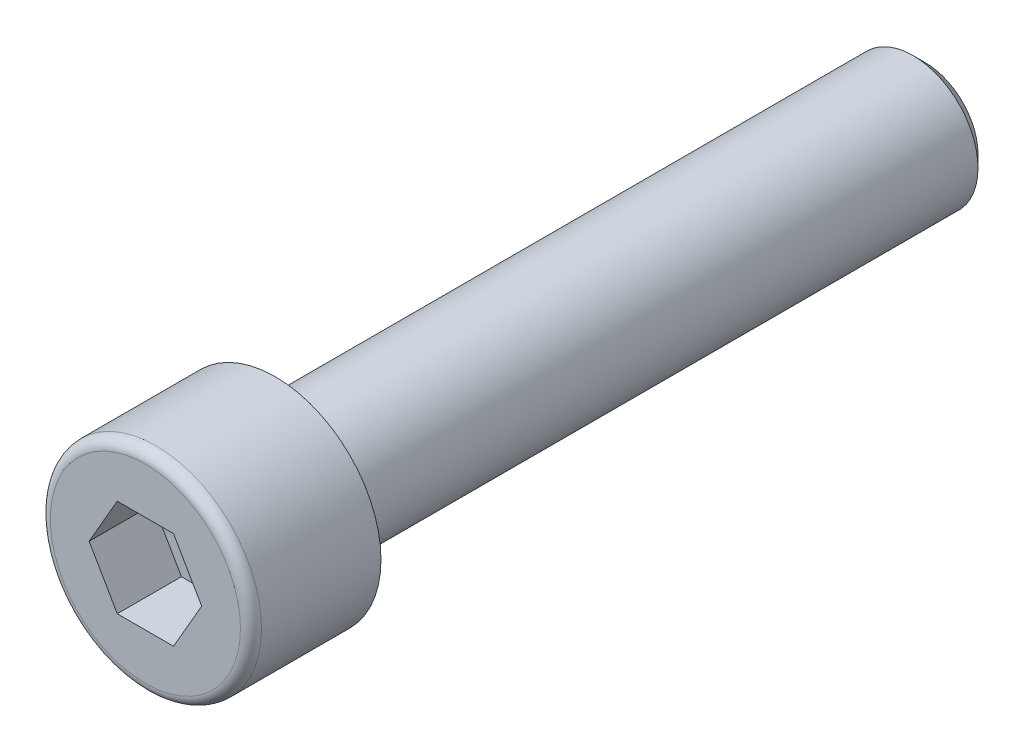
ISO-10303-21;
HEADER;
FILE_DESCRIPTION(('STEP AP214'),'2;1');
FILE_NAME('part.step','',(''),(''),'','','');
FILE_SCHEMA(('AUTOMOTIVE_DESIGN { 1 0 10303 214 1 1 1 1 }'));
ENDSEC;
DATA;
#1=APPLICATION_CONTEXT('core data for automotive mechanical design processes');
#2=APPLICATION_PROTOCOL_DEFINITION('international standard','automotive_design',2000,#1);
#3=PRODUCT_CONTEXT('',#1,'mechanical');
#4=PRODUCT('Part','Part','',(#3));
#5=PRODUCT_RELATED_PRODUCT_CATEGORY('part','',(#4));
#6=PRODUCT_DEFINITION_FORMATION('','',#4);
#7=PRODUCT_DEFINITION_CONTEXT('part definition',#1,'design');
#8=PRODUCT_DEFINITION('design','',#6,#7);
#9=PRODUCT_DEFINITION_SHAPE('','',#8);
#10=(LENGTH_UNIT() NAMED_UNIT(*) SI_UNIT(.MILLI.,.METRE.));
#11=(NAMED_UNIT(*) PLANE_ANGLE_UNIT() SI_UNIT($,.RADIAN.));
#12=(NAMED_UNIT(*) SI_UNIT($,.STERADIAN.) SOLID_ANGLE_UNIT());
#13=UNCERTAINTY_MEASURE_WITH_UNIT(LENGTH_MEASURE(1.E-05),#10,'distance_accuracy_value','');
#14=(GEOMETRIC_REPRESENTATION_CONTEXT(3) GLOBAL_UNCERTAINTY_ASSIGNED_CONTEXT((#13)) GLOBAL_UNIT_ASSIGNED_CONTEXT((#10,
#11,#12)) REPRESENTATION_CONTEXT('',''));
#15=CARTESIAN_POINT('',(0.,0.,0.));
#16=DIRECTION('',(0.,0.,1.));
#17=DIRECTION('',(1.,0.,0.));
#18=AXIS2_PLACEMENT_3D('',#15,#16,#17);
#19=CARTESIAN_POINT('',(0.,0.,4.05));
#20=DIRECTION('',(0.,0.,1.));
#21=DIRECTION('',(1.,0.,0.));
#22=AXIS2_PLACEMENT_3D('',#19,#20,#21);
#23=PLANE('',#22);
#24=DIRECTION('',(-1.,0.,0.));
#25=VECTOR('',#24,1.);
#26=CARTESIAN_POINT('',(-1.732,-2.999911998709,4.05));
#27=LINE('',#26,#25);
#28=CARTESIAN_POINT('',(1.732,-2.999911998709,4.05));
#29=VERTEX_POINT('',#28);
#30=CARTESIAN_POINT('',(-1.73199999999987,-2.99991199870892,4.05));
#31=VERTEX_POINT('',#30);
#32=EDGE_CURVE('E72',#29,#31,#27,.T.);
#33=ORIENTED_EDGE('',*,*,#32,.F.);
#34=DIRECTION('',(-0.50000000000019,-0.866025403784329,0.));
#35=VECTOR('',#34,1.);
#36=CARTESIAN_POINT('',(1.732,-2.999911998709,4.05));
#37=LINE('',#36,#35);
#38=CARTESIAN_POINT('',(3.46400000000013,0.,4.05));
#39=VERTEX_POINT('',#38);
#40=EDGE_CURVE('E133',#39,#29,#37,.T.);
#41=ORIENTED_EDGE('',*,*,#40,.F.);
#42=DIRECTION('',(0.50000000000019,-0.866025403784329,0.));
#43=VECTOR('',#42,1.);
#44=CARTESIAN_POINT('',(3.464,0.,4.05));
#45=LINE('',#44,#43);
#46=CARTESIAN_POINT('',(1.73199999999987,2.99991199870892,4.05));
#47=VERTEX_POINT('',#46);
#48=EDGE_CURVE('E143',#47,#39,#45,.T.);
#49=ORIENTED_EDGE('',*,*,#48,.F.);
#50=DIRECTION('',(1.,0.,0.));
#51=VECTOR('',#50,1.);
#52=CARTESIAN_POINT('',(1.732,2.999911998709,4.05));
#53=LINE('',#52,#51);
#54=CARTESIAN_POINT('',(-1.732,2.999911998709,4.05));
#55=VERTEX_POINT('',#54);
#56=EDGE_CURVE('E148',#55,#47,#53,.T.);
#57=ORIENTED_EDGE('',*,*,#56,.F.);
#58=DIRECTION('',(0.50000000000019,0.866025403784329,0.));
#59=VECTOR('',#58,1.);
#60=CARTESIAN_POINT('',(-1.732,2.999911998709,4.05));
#61=LINE('',#60,#59);
#62=CARTESIAN_POINT('',(-3.46400000000013,0.,4.05));
#63=VERTEX_POINT('',#62);
#64=EDGE_CURVE('E83',#63,#55,#61,.T.);
#65=ORIENTED_EDGE('',*,*,#64,.F.);
#66=DIRECTION('',(-0.50000000000019,0.866025403784329,0.));
#67=VECTOR('',#66,1.);
#68=CARTESIAN_POINT('',(-3.464,0.,4.05));
#69=LINE('',#68,#67);
#70=EDGE_CURVE('E67',#31,#63,#69,.T.);
#71=ORIENTED_EDGE('',*,*,#70,.F.);
#72=EDGE_LOOP('',(#33,#41,#49,#57,#65,#71));
#73=FACE_BOUND('',#72,.T.);
#74=ADVANCED_FACE('F17',(#73),#23,.T.);
#75=CARTESIAN_POINT('',(-1.732,-2.999911998709,4.05));
#76=DIRECTION('',(0.,1.,0.));
#77=DIRECTION('',(-1.,0.,0.));
#78=AXIS2_PLACEMENT_3D('',#75,#76,#77);
#79=PLANE('',#78);
#80=DIRECTION('',(0.,0.,1.));
#81=VECTOR('',#80,1.);
#82=CARTESIAN_POINT('',(1.732,-2.999911998709,4.05));
#83=LINE('',#82,#81);
#84=CARTESIAN_POINT('',(1.732,-2.999911998709,8.));
#85=VERTEX_POINT('',#84);
#86=EDGE_CURVE('E77',#29,#85,#83,.T.);
#87=ORIENTED_EDGE('',*,*,#86,.F.);
#88=ORIENTED_EDGE('',*,*,#32,.T.);
#89=DIRECTION('',(0.,0.,1.));
#90=VECTOR('',#89,1.);
#91=CARTESIAN_POINT('',(-1.73199999999947,-2.99991199870869,4.05));
#92=LINE('',#91,#90);
#93=CARTESIAN_POINT('',(-1.73199999999987,-2.99991199870892,8.));
#94=VERTEX_POINT('',#93);
#95=EDGE_CURVE('E74',#94,#31,#92,.F.);
#96=ORIENTED_EDGE('',*,*,#95,.F.);
#97=DIRECTION('',(1.,0.,0.));
#98=VECTOR('',#97,1.);
#99=CARTESIAN_POINT('',(0.,-2.999911998709,8.));
#100=LINE('',#99,#98);
#101=EDGE_CURVE('E140',#85,#94,#100,.F.);
#102=ORIENTED_EDGE('',*,*,#101,.F.);
#103=EDGE_LOOP('',(#87,#88,#96,#102));
#104=FACE_BOUND('',#103,.T.);
#105=ADVANCED_FACE('F73',(#104),#79,.T.);
#106=CARTESIAN_POINT('',(-3.464,0.,4.05));
#107=DIRECTION('',(0.866025403784329,0.50000000000019,0.));
#108=DIRECTION('',(-0.50000000000019,0.866025403784329,0.));
#109=AXIS2_PLACEMENT_3D('',#106,#107,#108);
#110=PLANE('',#109);
#111=ORIENTED_EDGE('',*,*,#95,.T.);
#112=ORIENTED_EDGE('',*,*,#70,.T.);
#113=DIRECTION('',(0.,0.,1.));
#114=VECTOR('',#113,1.);
#115=CARTESIAN_POINT('',(-3.46400000000053,3.06612374378901E-13,4.05));
#116=LINE('',#115,#114);
#117=CARTESIAN_POINT('',(-3.46400000000013,0.,8.));
#118=VERTEX_POINT('',#117);
#119=EDGE_CURVE('E85',#118,#63,#116,.F.);
#120=ORIENTED_EDGE('',*,*,#119,.F.);
#121=DIRECTION('',(-0.500000000000037,0.866025403784417,0.));
#122=VECTOR('',#121,1.);
#123=CARTESIAN_POINT('',(-1.732,-2.999911998709,8.));
#124=LINE('',#123,#122);
#125=EDGE_CURVE('E89',#94,#118,#124,.T.);
#126=ORIENTED_EDGE('',*,*,#125,.F.);
#127=EDGE_LOOP('',(#111,#112,#120,#126));
#128=FACE_BOUND('',#127,.T.);
#129=ADVANCED_FACE('F87',(#128),#110,.T.);
#130=CARTESIAN_POINT('',(-1.732,2.999911998709,4.05));
#131=DIRECTION('',(0.866025403784329,-0.50000000000019,0.));
#132=DIRECTION('',(0.50000000000019,0.866025403784329,0.));
#133=AXIS2_PLACEMENT_3D('',#130,#131,#132);
#134=PLANE('',#133);
#135=ORIENTED_EDGE('',*,*,#119,.T.);
#136=ORIENTED_EDGE('',*,*,#64,.T.);
#137=DIRECTION('',(0.,0.,1.));
#138=VECTOR('',#137,1.);
#139=CARTESIAN_POINT('',(-1.732,2.999911998709,4.05));
#140=LINE('',#139,#138);
#141=CARTESIAN_POINT('',(-1.732,2.999911998709,8.));
#142=VERTEX_POINT('',#141);
#143=EDGE_CURVE('E150',#142,#55,#140,.F.);
#144=ORIENTED_EDGE('',*,*,#143,.F.);
#145=DIRECTION('',(0.500000000000037,0.866025403784417,0.));
#146=VECTOR('',#145,1.);
#147=CARTESIAN_POINT('',(-3.464,0.,8.));
#148=LINE('',#147,#146);
#149=EDGE_CURVE('E157',#118,#142,#148,.T.);
#150=ORIENTED_EDGE('',*,*,#149,.F.);
#151=EDGE_LOOP('',(#135,#136,#144,#150));
#152=FACE_BOUND('',#151,.T.);
#153=ADVANCED_FACE('F155',(#152),#134,.T.);
#154=CARTESIAN_POINT('',(1.732,2.999911998709,4.05));
#155=DIRECTION('',(0.,-1.,0.));
#156=DIRECTION('',(1.,0.,0.));
#157=AXIS2_PLACEMENT_3D('',#154,#155,#156);
#158=PLANE('',#157);
#159=ORIENTED_EDGE('',*,*,#143,.T.);
#160=ORIENTED_EDGE('',*,*,#56,.T.);
#161=DIRECTION('',(0.,0.,1.));
#162=VECTOR('',#161,1.);
#163=CARTESIAN_POINT('',(1.73199999999947,2.99991199870869,4.05));
#164=LINE('',#163,#162);
#165=CARTESIAN_POINT('',(1.73199999999987,2.99991199870892,8.));
#166=VERTEX_POINT('',#165);
#167=EDGE_CURVE('E145',#166,#47,#164,.F.);
#168=ORIENTED_EDGE('',*,*,#167,.F.);
#169=DIRECTION('',(1.,0.,0.));
#170=VECTOR('',#169,1.);
#171=CARTESIAN_POINT('',(0.,2.999911998709,8.));
#172=LINE('',#171,#170);
#173=EDGE_CURVE('E161',#142,#166,#172,.T.);
#174=ORIENTED_EDGE('',*,*,#173,.F.);
#175=EDGE_LOOP('',(#159,#160,#168,#174));
#176=FACE_BOUND('',#175,.T.);
#177=ADVANCED_FACE('F183',(#176),#158,.T.);
#178=CARTESIAN_POINT('',(3.464,0.,4.05));
#179=DIRECTION('',(-0.866025403784329,-0.50000000000019,0.));
#180=DIRECTION('',(0.50000000000019,-0.866025403784329,0.));
#181=AXIS2_PLACEMENT_3D('',#178,#179,#180);
#182=PLANE('',#181);
#183=ORIENTED_EDGE('',*,*,#167,.T.);
#184=ORIENTED_EDGE('',*,*,#48,.T.);
#185=DIRECTION('',(0.,0.,1.));
#186=VECTOR('',#185,1.);
#187=CARTESIAN_POINT('',(3.46400000000053,-3.05745012640912E-13,4.05));
#188=LINE('',#187,#186);
#189=CARTESIAN_POINT('',(3.46400000000013,0.,8.));
#190=VERTEX_POINT('',#189);
#191=EDGE_CURVE('E35',#190,#39,#188,.F.);
#192=ORIENTED_EDGE('',*,*,#191,.F.);
#193=DIRECTION('',(0.500000000000037,-0.866025403784417,0.));
#194=VECTOR('',#193,1.);
#195=CARTESIAN_POINT('',(1.732,2.999911998709,8.));
#196=LINE('',#195,#194);
#197=EDGE_CURVE('E169',#166,#190,#196,.T.);
#198=ORIENTED_EDGE('',*,*,#197,.F.);
#199=EDGE_LOOP('',(#183,#184,#192,#198));
#200=FACE_BOUND('',#199,.T.);
#201=ADVANCED_FACE('F181',(#200),#182,.T.);
#202=CARTESIAN_POINT('',(1.732,-2.999911998709,4.05));
#203=DIRECTION('',(-0.866025403784329,0.50000000000019,0.));
#204=DIRECTION('',(-0.50000000000019,-0.866025403784329,0.));
#205=AXIS2_PLACEMENT_3D('',#202,#203,#204);
#206=PLANE('',#205);
#207=ORIENTED_EDGE('',*,*,#191,.T.);
#208=ORIENTED_EDGE('',*,*,#40,.T.);
#209=ORIENTED_EDGE('',*,*,#86,.T.);
#210=DIRECTION('',(-0.500000000000037,-0.866025403784417,0.));
#211=VECTOR('',#210,1.);
#212=CARTESIAN_POINT('',(3.464,0.,8.));
#213=LINE('',#212,#211);
#214=EDGE_CURVE('E109',#190,#85,#213,.T.);
#215=ORIENTED_EDGE('',*,*,#214,.F.);
#216=EDGE_LOOP('',(#207,#208,#209,#215));
#217=FACE_BOUND('',#216,.T.);
#218=ADVANCED_FACE('F179',(#217),#206,.T.);
#219=CARTESIAN_POINT('',(0.,0.,8.));
#220=DIRECTION('',(0.,0.,1.));
#221=DIRECTION('',(1.,0.,0.));
#222=AXIS2_PLACEMENT_3D('',#219,#220,#221);
#223=PLANE('',#222);
#224=ORIENTED_EDGE('',*,*,#197,.T.);
#225=ORIENTED_EDGE('',*,*,#214,.T.);
#226=ORIENTED_EDGE('',*,*,#101,.T.);
#227=ORIENTED_EDGE('',*,*,#125,.T.);
#228=ORIENTED_EDGE('',*,*,#149,.T.);
#229=ORIENTED_EDGE('',*,*,#173,.T.);
#230=EDGE_LOOP('',(#224,#225,#226,#227,#228,#229));
#231=FACE_BOUND('',#230,.T.);
#232=CARTESIAN_POINT('',(0.,0.,8.));
#233=DIRECTION('',(0.,0.,-1.));
#234=DIRECTION('',(1.,0.,0.));
#235=AXIS2_PLACEMENT_3D('',#232,#233,#234);
#236=CIRCLE('',#235,5.85);
#237=CARTESIAN_POINT('',(5.85,0.,8.));
#238=VERTEX_POINT('',#237);
#239=EDGE_CURVE('E104',#238,#238,#236,.T.);
#240=ORIENTED_EDGE('',*,*,#239,.F.);
#241=EDGE_LOOP('',(#240));
#242=FACE_BOUND('',#241,.T.);
#243=ADVANCED_FACE('F122',(#231,#242),#223,.T.);
#244=CARTESIAN_POINT('',(0.,0.,7.35));
#245=DIRECTION('',(0.,0.,1.));
#246=DIRECTION('',(1.,0.,0.));
#247=AXIS2_PLACEMENT_3D('',#244,#245,#246);
#248=TOROIDAL_SURFACE('',#247,5.85,0.65);
#249=ORIENTED_EDGE('',*,*,#239,.T.);
#250=EDGE_LOOP('',(#249));
#251=FACE_BOUND('',#250,.T.);
#252=CARTESIAN_POINT('',(0.,0.,7.35));
#253=DIRECTION('',(0.,0.,1.));
#254=DIRECTION('',(1.,0.,0.));
#255=AXIS2_PLACEMENT_3D('',#252,#253,#254);
#256=CIRCLE('',#255,6.5);
#257=CARTESIAN_POINT('',(6.5,0.,7.35));
#258=VERTEX_POINT('',#257);
#259=EDGE_CURVE('E100',#258,#258,#256,.F.);
#260=ORIENTED_EDGE('',*,*,#259,.F.);
#261=EDGE_LOOP('',(#260));
#262=FACE_BOUND('',#261,.T.);
#263=ADVANCED_FACE('F116',(#251,#262),#248,.T.);
#264=CARTESIAN_POINT('',(0.,0.,-40.));
#265=DIRECTION('',(0.,0.,1.));
#266=DIRECTION('',(1.,0.,0.));
#267=AXIS2_PLACEMENT_3D('',#264,#265,#266);
#268=PLANE('',#267);
#269=CARTESIAN_POINT('',(0.,0.,-39.9999999999068));
#270=DIRECTION('',(0.,0.,1.));
#271=DIRECTION('',(1.,0.,0.));
#272=AXIS2_PLACEMENT_3D('',#269,#270,#271);
#273=CIRCLE('',#272,3.25000000003683);
#274=CARTESIAN_POINT('',(3.25000000003683,0.,-39.9999999999068));
#275=VERTEX_POINT('',#274);
#276=EDGE_CURVE('E20',#275,#275,#273,.T.);
#277=ORIENTED_EDGE('',*,*,#276,.F.);
#278=EDGE_LOOP('',(#277));
#279=FACE_BOUND('',#278,.T.);
#280=ADVANCED_FACE('F121',(#279),#268,.F.);
#281=CARTESIAN_POINT('',(0.,0.,0.));
#282=DIRECTION('',(0.,0.,1.));
#283=DIRECTION('',(1.,0.,0.));
#284=AXIS2_PLACEMENT_3D('',#281,#282,#283);
#285=CYLINDRICAL_SURFACE('',#284,6.5);
#286=ORIENTED_EDGE('',*,*,#259,.T.);
#287=EDGE_LOOP('',(#286));
#288=FACE_BOUND('',#287,.T.);
#289=CARTESIAN_POINT('',(0.,0.,0.));
#290=DIRECTION('',(0.,0.,1.));
#291=DIRECTION('',(1.,0.,0.));
#292=AXIS2_PLACEMENT_3D('',#289,#290,#291);
#293=CIRCLE('',#292,6.5);
#294=CARTESIAN_POINT('',(6.5,0.,0.));
#295=VERTEX_POINT('',#294);
#296=EDGE_CURVE('E93',#295,#295,#293,.T.);
#297=ORIENTED_EDGE('',*,*,#296,.T.);
#298=EDGE_LOOP('',(#297));
#299=FACE_BOUND('',#298,.T.);
#300=ADVANCED_FACE('F207',(#288,#299),#285,.T.);
#301=CARTESIAN_POINT('',(0.,0.,-39.2500000000382));
#302=DIRECTION('',(0.,0.,1.));
#303=DIRECTION('',(1.,0.,0.));
#304=AXIS2_PLACEMENT_3D('',#301,#302,#303);
#305=CONICAL_SURFACE('',#304,3.99999999996226,0.785398163435344);
#306=CARTESIAN_POINT('',(0.,0.,-39.25));
#307=DIRECTION('',(0.,0.,1.));
#308=DIRECTION('',(1.,0.,0.));
#309=AXIS2_PLACEMENT_3D('',#306,#307,#308);
#310=CIRCLE('',#309,4.);
#311=CARTESIAN_POINT('',(4.,0.,-39.25));
#312=VERTEX_POINT('',#311);
#313=EDGE_CURVE('E26',#312,#312,#310,.T.);
#314=ORIENTED_EDGE('',*,*,#313,.F.);
#315=EDGE_LOOP('',(#314));
#316=FACE_BOUND('',#315,.T.);
#317=ORIENTED_EDGE('',*,*,#276,.T.);
#318=EDGE_LOOP('',(#317));
#319=FACE_BOUND('',#318,.T.);
#320=ADVANCED_FACE('F201',(#316,#319),#305,.T.);
#321=CARTESIAN_POINT('',(0.,0.,0.));
#322=DIRECTION('',(0.,0.,1.));
#323=DIRECTION('',(1.,0.,0.));
#324=AXIS2_PLACEMENT_3D('',#321,#322,#323);
#325=PLANE('',#324);
#326=ORIENTED_EDGE('',*,*,#296,.F.);
#327=EDGE_LOOP('',(#326));
#328=FACE_BOUND('',#327,.T.);
#329=CARTESIAN_POINT('',(0.,0.,0.));
#330=DIRECTION('',(0.,0.,1.));
#331=DIRECTION('',(1.,0.,0.));
#332=AXIS2_PLACEMENT_3D('',#329,#330,#331);
#333=CIRCLE('',#332,4.);
#334=CARTESIAN_POINT('',(4.,0.,0.));
#335=VERTEX_POINT('',#334);
#336=EDGE_CURVE('E11',#335,#335,#333,.F.);
#337=ORIENTED_EDGE('',*,*,#336,.F.);
#338=EDGE_LOOP('',(#337));
#339=FACE_BOUND('',#338,.T.);
#340=ADVANCED_FACE('F195',(#328,#339),#325,.F.);
#341=CARTESIAN_POINT('',(0.,0.,-39.25));
#342=DIRECTION('',(0.,0.,1.));
#343=DIRECTION('',(1.,0.,0.));
#344=AXIS2_PLACEMENT_3D('',#341,#342,#343);
#345=CYLINDRICAL_SURFACE('',#344,4.);
#346=ORIENTED_EDGE('',*,*,#336,.T.);
#347=EDGE_LOOP('',(#346));
#348=FACE_BOUND('',#347,.T.);
#349=ORIENTED_EDGE('',*,*,#313,.T.);
#350=EDGE_LOOP('',(#349));
#351=FACE_BOUND('',#350,.T.);
#352=ADVANCED_FACE('F193',(#348,#351),#345,.T.);
#353=CLOSED_SHELL('',(#74,#105,#129,#153,#177,#201,#218,#243,#263,#280,#300,#320,#340,#352));
#354=MANIFOLD_SOLID_BREP('B1',#353);
#355=ADVANCED_BREP_SHAPE_REPRESENTATION('',(#18,#354),#14);
#356=SHAPE_DEFINITION_REPRESENTATION(#9,#355);
ENDSEC;
END-ISO-10303-21;
